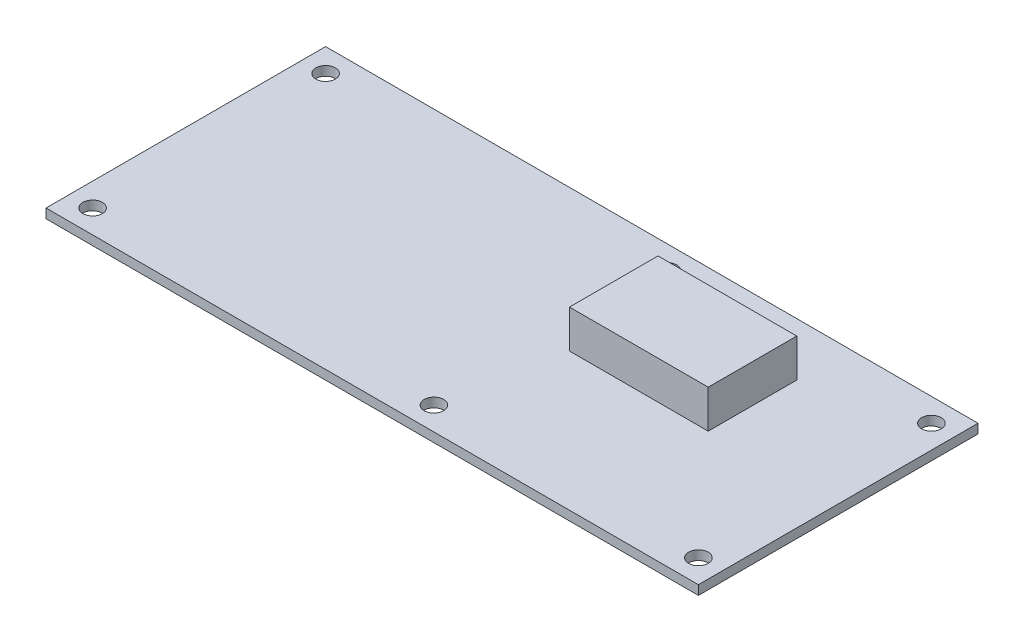
ISO-10303-21;
HEADER;
FILE_DESCRIPTION(('STEP AP214'),'2;1');
FILE_NAME('part.step','',(''),(''),'','','');
FILE_SCHEMA(('AUTOMOTIVE_DESIGN { 1 0 10303 214 1 1 1 1 }'));
ENDSEC;
DATA;
#1=APPLICATION_CONTEXT('core data for automotive mechanical design processes');
#2=APPLICATION_PROTOCOL_DEFINITION('international standard','automotive_design',2000,#1);
#3=PRODUCT_CONTEXT('',#1,'mechanical');
#4=PRODUCT('Part','Part','',(#3));
#5=PRODUCT_RELATED_PRODUCT_CATEGORY('part','',(#4));
#6=PRODUCT_DEFINITION_FORMATION('','',#4);
#7=PRODUCT_DEFINITION_CONTEXT('part definition',#1,'design');
#8=PRODUCT_DEFINITION('design','',#6,#7);
#9=PRODUCT_DEFINITION_SHAPE('','',#8);
#10=(LENGTH_UNIT() NAMED_UNIT(*) SI_UNIT(.MILLI.,.METRE.));
#11=(NAMED_UNIT(*) PLANE_ANGLE_UNIT() SI_UNIT($,.RADIAN.));
#12=(NAMED_UNIT(*) SI_UNIT($,.STERADIAN.) SOLID_ANGLE_UNIT());
#13=UNCERTAINTY_MEASURE_WITH_UNIT(LENGTH_MEASURE(1.E-05),#10,'distance_accuracy_value','');
#14=(GEOMETRIC_REPRESENTATION_CONTEXT(3) GLOBAL_UNCERTAINTY_ASSIGNED_CONTEXT((#13)) GLOBAL_UNIT_ASSIGNED_CONTEXT((#10,
#11,#12)) REPRESENTATION_CONTEXT('',''));
#15=CARTESIAN_POINT('',(0.,0.,0.));
#16=DIRECTION('',(0.,0.,1.));
#17=DIRECTION('',(1.,0.,0.));
#18=AXIS2_PLACEMENT_3D('',#15,#16,#17);
#19=CARTESIAN_POINT('',(0.,2.,0.));
#20=DIRECTION('',(0.,1.,0.));
#21=DIRECTION('',(0.,0.,1.));
#22=AXIS2_PLACEMENT_3D('',#19,#20,#21);
#23=PLANE('',#22);
#24=CARTESIAN_POINT('',(56.75,2.,25.));
#25=DIRECTION('',(0.,1.,0.));
#26=DIRECTION('',(0.,0.,1.));
#27=AXIS2_PLACEMENT_3D('',#24,#25,#26);
#28=CIRCLE('',#27,2.0955);
#29=CARTESIAN_POINT('',(56.75,2.,27.0955));
#30=VERTEX_POINT('',#29);
#31=EDGE_CURVE('E174',#30,#30,#28,.T.);
#32=ORIENTED_EDGE('',*,*,#31,.F.);
#33=EDGE_LOOP('',(#32));
#34=FACE_BOUND('',#33,.T.);
#35=CARTESIAN_POINT('',(56.75,2.,-25.));
#36=DIRECTION('',(0.,1.,0.));
#37=DIRECTION('',(0.,0.,1.));
#38=AXIS2_PLACEMENT_3D('',#35,#36,#37);
#39=CIRCLE('',#38,2.0955);
#40=CARTESIAN_POINT('',(56.75,2.,-22.9045));
#41=VERTEX_POINT('',#40);
#42=EDGE_CURVE('E177',#41,#41,#39,.T.);
#43=ORIENTED_EDGE('',*,*,#42,.F.);
#44=EDGE_LOOP('',(#43));
#45=FACE_BOUND('',#44,.T.);
#46=CARTESIAN_POINT('',(0.,2.,-25.));
#47=DIRECTION('',(0.,1.,0.));
#48=DIRECTION('',(0.,0.,1.));
#49=AXIS2_PLACEMENT_3D('',#46,#47,#48);
#50=CIRCLE('',#49,2.0955);
#51=CARTESIAN_POINT('',(0.,2.,-22.9045));
#52=VERTEX_POINT('',#51);
#53=EDGE_CURVE('E180',#52,#52,#50,.T.);
#54=ORIENTED_EDGE('',*,*,#53,.F.);
#55=EDGE_LOOP('',(#54));
#56=FACE_BOUND('',#55,.T.);
#57=CARTESIAN_POINT('',(0.,2.,25.));
#58=DIRECTION('',(0.,1.,0.));
#59=DIRECTION('',(0.,0.,1.));
#60=AXIS2_PLACEMENT_3D('',#57,#58,#59);
#61=CIRCLE('',#60,2.0955);
#62=CARTESIAN_POINT('',(0.,2.,27.0955));
#63=VERTEX_POINT('',#62);
#64=EDGE_CURVE('E183',#63,#63,#61,.T.);
#65=ORIENTED_EDGE('',*,*,#64,.F.);
#66=EDGE_LOOP('',(#65));
#67=FACE_BOUND('',#66,.T.);
#68=CARTESIAN_POINT('',(-73.25,2.,-25.));
#69=DIRECTION('',(0.,1.,0.));
#70=DIRECTION('',(0.,0.,1.));
#71=AXIS2_PLACEMENT_3D('',#68,#69,#70);
#72=CIRCLE('',#71,2.0955);
#73=CARTESIAN_POINT('',(-73.25,2.,-22.9045));
#74=VERTEX_POINT('',#73);
#75=EDGE_CURVE('E186',#74,#74,#72,.T.);
#76=ORIENTED_EDGE('',*,*,#75,.F.);
#77=EDGE_LOOP('',(#76));
#78=FACE_BOUND('',#77,.T.);
#79=CARTESIAN_POINT('',(-73.25,2.,25.));
#80=DIRECTION('',(0.,1.,0.));
#81=DIRECTION('',(0.,0.,1.));
#82=AXIS2_PLACEMENT_3D('',#79,#80,#81);
#83=CIRCLE('',#82,2.0955);
#84=CARTESIAN_POINT('',(-73.25,2.,27.0955));
#85=VERTEX_POINT('',#84);
#86=EDGE_CURVE('E189',#85,#85,#83,.T.);
#87=ORIENTED_EDGE('',*,*,#86,.F.);
#88=EDGE_LOOP('',(#87));
#89=FACE_BOUND('',#88,.T.);
#90=DIRECTION('',(0.,0.,1.));
#91=VECTOR('',#90,1.);
#92=CARTESIAN_POINT('',(61.75,2.,0.));
#93=LINE('',#92,#91);
#94=CARTESIAN_POINT('',(61.75,2.,-30.));
#95=VERTEX_POINT('',#94);
#96=CARTESIAN_POINT('',(61.75,2.,30.));
#97=VERTEX_POINT('',#96);
#98=EDGE_CURVE('E167',#95,#97,#93,.T.);
#99=ORIENTED_EDGE('',*,*,#98,.F.);
#100=DIRECTION('',(1.,0.,0.));
#101=VECTOR('',#100,1.);
#102=CARTESIAN_POINT('',(0.,2.,-30.));
#103=LINE('',#102,#101);
#104=CARTESIAN_POINT('',(-78.25,2.,-30.));
#105=VERTEX_POINT('',#104);
#106=EDGE_CURVE('E171',#105,#95,#103,.T.);
#107=ORIENTED_EDGE('',*,*,#106,.F.);
#108=DIRECTION('',(0.,0.,1.));
#109=VECTOR('',#108,1.);
#110=CARTESIAN_POINT('',(-78.25,2.,0.));
#111=LINE('',#110,#109);
#112=CARTESIAN_POINT('',(-78.25,2.,30.));
#113=VERTEX_POINT('',#112);
#114=EDGE_CURVE('E84',#105,#113,#111,.T.);
#115=ORIENTED_EDGE('',*,*,#114,.T.);
#116=DIRECTION('',(1.,0.,0.));
#117=VECTOR('',#116,1.);
#118=CARTESIAN_POINT('',(0.,2.,30.));
#119=LINE('',#118,#117);
#120=EDGE_CURVE('E109',#113,#97,#119,.T.);
#121=ORIENTED_EDGE('',*,*,#120,.T.);
#122=EDGE_LOOP('',(#99,#107,#115,#121));
#123=FACE_BOUND('',#122,.T.);
#124=DIRECTION('',(1.,0.,0.));
#125=VECTOR('',#124,1.);
#126=CARTESIAN_POINT('',(4.49822493646934,2.,0.414801434061474));
#127=LINE('',#126,#125);
#128=CARTESIAN_POINT('',(4.49822493646934,2.,0.414801434061474));
#129=VERTEX_POINT('',#128);
#130=CARTESIAN_POINT('',(34.2753144136481,2.,0.414801434061474));
#131=VERTEX_POINT('',#130);
#132=EDGE_CURVE('E236',#129,#131,#127,.T.);
#133=ORIENTED_EDGE('',*,*,#132,.F.);
#134=DIRECTION('',(0.,0.,1.));
#135=VECTOR('',#134,1.);
#136=CARTESIAN_POINT('',(4.49822493646934,2.,0.414801434061474));
#137=LINE('',#136,#135);
#138=CARTESIAN_POINT('',(4.49822493646934,2.,-18.5854108609362));
#139=VERTEX_POINT('',#138);
#140=EDGE_CURVE('E156',#139,#129,#137,.T.);
#141=ORIENTED_EDGE('',*,*,#140,.F.);
#142=DIRECTION('',(-1.,0.,0.));
#143=VECTOR('',#142,1.);
#144=CARTESIAN_POINT('',(4.49822493646934,2.,-18.5854108609362));
#145=LINE('',#144,#143);
#146=CARTESIAN_POINT('',(34.2753144136481,2.,-18.5854108609362));
#147=VERTEX_POINT('',#146);
#148=EDGE_CURVE('E152',#147,#139,#145,.T.);
#149=ORIENTED_EDGE('',*,*,#148,.F.);
#150=DIRECTION('',(0.,0.,-1.));
#151=VECTOR('',#150,1.);
#152=CARTESIAN_POINT('',(34.2753144136481,2.,0.414801434061474));
#153=LINE('',#152,#151);
#154=EDGE_CURVE('E238',#131,#147,#153,.T.);
#155=ORIENTED_EDGE('',*,*,#154,.F.);
#156=EDGE_LOOP('',(#133,#141,#149,#155));
#157=FACE_BOUND('',#156,.T.);
#158=ADVANCED_FACE('F60',(#34,#45,#56,#67,#78,#89,#123,#157),#23,.T.);
#159=CARTESIAN_POINT('',(0.,0.,0.));
#160=DIRECTION('',(0.,1.,0.));
#161=DIRECTION('',(0.,0.,1.));
#162=AXIS2_PLACEMENT_3D('',#159,#160,#161);
#163=PLANE('',#162);
#164=DIRECTION('',(1.,0.,0.));
#165=VECTOR('',#164,1.);
#166=CARTESIAN_POINT('',(0.,0.,-30.));
#167=LINE('',#166,#165);
#168=CARTESIAN_POINT('',(-78.25,0.,-30.));
#169=VERTEX_POINT('',#168);
#170=CARTESIAN_POINT('',(61.75,0.,-30.));
#171=VERTEX_POINT('',#170);
#172=EDGE_CURVE('E195',#169,#171,#167,.T.);
#173=ORIENTED_EDGE('',*,*,#172,.T.);
#174=DIRECTION('',(0.,0.,1.));
#175=VECTOR('',#174,1.);
#176=CARTESIAN_POINT('',(61.75,0.,0.));
#177=LINE('',#176,#175);
#178=CARTESIAN_POINT('',(61.75,0.,30.));
#179=VERTEX_POINT('',#178);
#180=EDGE_CURVE('E161',#171,#179,#177,.T.);
#181=ORIENTED_EDGE('',*,*,#180,.T.);
#182=DIRECTION('',(1.,0.,0.));
#183=VECTOR('',#182,1.);
#184=CARTESIAN_POINT('',(0.,0.,30.));
#185=LINE('',#184,#183);
#186=CARTESIAN_POINT('',(-78.25,0.,30.));
#187=VERTEX_POINT('',#186);
#188=EDGE_CURVE('E158',#187,#179,#185,.T.);
#189=ORIENTED_EDGE('',*,*,#188,.F.);
#190=DIRECTION('',(0.,0.,1.));
#191=VECTOR('',#190,1.);
#192=CARTESIAN_POINT('',(-78.25,0.,0.));
#193=LINE('',#192,#191);
#194=EDGE_CURVE('E104',#169,#187,#193,.T.);
#195=ORIENTED_EDGE('',*,*,#194,.F.);
#196=EDGE_LOOP('',(#173,#181,#189,#195));
#197=FACE_BOUND('',#196,.T.);
#198=CARTESIAN_POINT('',(-73.25,0.,25.));
#199=DIRECTION('',(0.,1.,0.));
#200=DIRECTION('',(0.,0.,1.));
#201=AXIS2_PLACEMENT_3D('',#198,#199,#200);
#202=CIRCLE('',#201,2.0955);
#203=CARTESIAN_POINT('',(-73.25,0.,27.0955));
#204=VERTEX_POINT('',#203);
#205=EDGE_CURVE('E168',#204,#204,#202,.T.);
#206=ORIENTED_EDGE('',*,*,#205,.T.);
#207=EDGE_LOOP('',(#206));
#208=FACE_BOUND('',#207,.T.);
#209=CARTESIAN_POINT('',(-73.25,0.,-25.));
#210=DIRECTION('',(0.,1.,0.));
#211=DIRECTION('',(0.,0.,1.));
#212=AXIS2_PLACEMENT_3D('',#209,#210,#211);
#213=CIRCLE('',#212,2.0955);
#214=CARTESIAN_POINT('',(-73.25,0.,-22.9045));
#215=VERTEX_POINT('',#214);
#216=EDGE_CURVE('E210',#215,#215,#213,.T.);
#217=ORIENTED_EDGE('',*,*,#216,.T.);
#218=EDGE_LOOP('',(#217));
#219=FACE_BOUND('',#218,.T.);
#220=CARTESIAN_POINT('',(0.,0.,25.));
#221=DIRECTION('',(0.,1.,0.));
#222=DIRECTION('',(0.,0.,1.));
#223=AXIS2_PLACEMENT_3D('',#220,#221,#222);
#224=CIRCLE('',#223,2.0955);
#225=CARTESIAN_POINT('',(0.,0.,27.0955));
#226=VERTEX_POINT('',#225);
#227=EDGE_CURVE('E207',#226,#226,#224,.T.);
#228=ORIENTED_EDGE('',*,*,#227,.T.);
#229=EDGE_LOOP('',(#228));
#230=FACE_BOUND('',#229,.T.);
#231=CARTESIAN_POINT('',(0.,0.,-25.));
#232=DIRECTION('',(0.,1.,0.));
#233=DIRECTION('',(0.,0.,1.));
#234=AXIS2_PLACEMENT_3D('',#231,#232,#233);
#235=CIRCLE('',#234,2.0955);
#236=CARTESIAN_POINT('',(0.,0.,-22.9045));
#237=VERTEX_POINT('',#236);
#238=EDGE_CURVE('E204',#237,#237,#235,.T.);
#239=ORIENTED_EDGE('',*,*,#238,.T.);
#240=EDGE_LOOP('',(#239));
#241=FACE_BOUND('',#240,.T.);
#242=CARTESIAN_POINT('',(56.75,0.,-25.));
#243=DIRECTION('',(0.,1.,0.));
#244=DIRECTION('',(0.,0.,1.));
#245=AXIS2_PLACEMENT_3D('',#242,#243,#244);
#246=CIRCLE('',#245,2.0955);
#247=CARTESIAN_POINT('',(56.75,0.,-22.9045));
#248=VERTEX_POINT('',#247);
#249=EDGE_CURVE('E201',#248,#248,#246,.T.);
#250=ORIENTED_EDGE('',*,*,#249,.T.);
#251=EDGE_LOOP('',(#250));
#252=FACE_BOUND('',#251,.T.);
#253=CARTESIAN_POINT('',(56.75,0.,25.));
#254=DIRECTION('',(0.,1.,0.));
#255=DIRECTION('',(0.,0.,1.));
#256=AXIS2_PLACEMENT_3D('',#253,#254,#255);
#257=CIRCLE('',#256,2.0955);
#258=CARTESIAN_POINT('',(56.75,0.,27.0955));
#259=VERTEX_POINT('',#258);
#260=EDGE_CURVE('E198',#259,#259,#257,.T.);
#261=ORIENTED_EDGE('',*,*,#260,.T.);
#262=EDGE_LOOP('',(#261));
#263=FACE_BOUND('',#262,.T.);
#264=ADVANCED_FACE('F227',(#197,#208,#219,#230,#241,#252,#263),#163,.F.);
#265=CARTESIAN_POINT('',(-78.25,2.,0.));
#266=DIRECTION('',(1.,0.,0.));
#267=DIRECTION('',(0.,0.,-1.));
#268=AXIS2_PLACEMENT_3D('',#265,#266,#267);
#269=PLANE('',#268);
#270=ORIENTED_EDGE('',*,*,#194,.T.);
#271=DIRECTION('',(0.,-1.,0.));
#272=VECTOR('',#271,1.);
#273=CARTESIAN_POINT('',(-78.25,2.,30.));
#274=LINE('',#273,#272);
#275=EDGE_CURVE('E191',#113,#187,#274,.T.);
#276=ORIENTED_EDGE('',*,*,#275,.F.);
#277=ORIENTED_EDGE('',*,*,#114,.F.);
#278=DIRECTION('',(0.,-1.,0.));
#279=VECTOR('',#278,1.);
#280=CARTESIAN_POINT('',(-78.25,2.,-30.));
#281=LINE('',#280,#279);
#282=EDGE_CURVE('E216',#105,#169,#281,.T.);
#283=ORIENTED_EDGE('',*,*,#282,.T.);
#284=EDGE_LOOP('',(#270,#276,#277,#283));
#285=FACE_BOUND('',#284,.T.);
#286=ADVANCED_FACE('F230',(#285),#269,.F.);
#287=CARTESIAN_POINT('',(0.,2.,30.));
#288=DIRECTION('',(0.,0.,-1.));
#289=DIRECTION('',(-1.,0.,0.));
#290=AXIS2_PLACEMENT_3D('',#287,#288,#289);
#291=PLANE('',#290);
#292=ORIENTED_EDGE('',*,*,#188,.T.);
#293=DIRECTION('',(0.,-1.,0.));
#294=VECTOR('',#293,1.);
#295=CARTESIAN_POINT('',(61.75,2.,30.));
#296=LINE('',#295,#294);
#297=EDGE_CURVE('E12',#97,#179,#296,.T.);
#298=ORIENTED_EDGE('',*,*,#297,.F.);
#299=ORIENTED_EDGE('',*,*,#120,.F.);
#300=ORIENTED_EDGE('',*,*,#275,.T.);
#301=EDGE_LOOP('',(#292,#298,#299,#300));
#302=FACE_BOUND('',#301,.T.);
#303=ADVANCED_FACE('F62',(#302),#291,.F.);
#304=CARTESIAN_POINT('',(61.75,2.,0.));
#305=DIRECTION('',(1.,0.,0.));
#306=DIRECTION('',(0.,0.,-1.));
#307=AXIS2_PLACEMENT_3D('',#304,#305,#306);
#308=PLANE('',#307);
#309=ORIENTED_EDGE('',*,*,#180,.F.);
#310=DIRECTION('',(0.,-1.,0.));
#311=VECTOR('',#310,1.);
#312=CARTESIAN_POINT('',(61.75,2.,-30.));
#313=LINE('',#312,#311);
#314=EDGE_CURVE('E68',#95,#171,#313,.T.);
#315=ORIENTED_EDGE('',*,*,#314,.F.);
#316=ORIENTED_EDGE('',*,*,#98,.T.);
#317=ORIENTED_EDGE('',*,*,#297,.T.);
#318=EDGE_LOOP('',(#309,#315,#316,#317));
#319=FACE_BOUND('',#318,.T.);
#320=ADVANCED_FACE('F224',(#319),#308,.T.);
#321=CARTESIAN_POINT('',(0.,2.,-30.));
#322=DIRECTION('',(0.,0.,-1.));
#323=DIRECTION('',(-1.,0.,0.));
#324=AXIS2_PLACEMENT_3D('',#321,#322,#323);
#325=PLANE('',#324);
#326=ORIENTED_EDGE('',*,*,#314,.T.);
#327=ORIENTED_EDGE('',*,*,#172,.F.);
#328=ORIENTED_EDGE('',*,*,#282,.F.);
#329=ORIENTED_EDGE('',*,*,#106,.T.);
#330=EDGE_LOOP('',(#326,#327,#328,#329));
#331=FACE_BOUND('',#330,.T.);
#332=ADVANCED_FACE('F222',(#331),#325,.T.);
#333=CARTESIAN_POINT('',(56.75,2.,25.));
#334=DIRECTION('',(0.,-1.,0.));
#335=DIRECTION('',(0.,0.,-1.));
#336=AXIS2_PLACEMENT_3D('',#333,#334,#335);
#337=CYLINDRICAL_SURFACE('',#336,2.0955);
#338=ORIENTED_EDGE('',*,*,#31,.T.);
#339=EDGE_LOOP('',(#338));
#340=FACE_BOUND('',#339,.T.);
#341=ORIENTED_EDGE('',*,*,#260,.F.);
#342=EDGE_LOOP('',(#341));
#343=FACE_BOUND('',#342,.T.);
#344=ADVANCED_FACE('F284',(#340,#343),#337,.F.);
#345=CARTESIAN_POINT('',(56.75,2.,-25.));
#346=DIRECTION('',(0.,-1.,0.));
#347=DIRECTION('',(0.,0.,-1.));
#348=AXIS2_PLACEMENT_3D('',#345,#346,#347);
#349=CYLINDRICAL_SURFACE('',#348,2.0955);
#350=ORIENTED_EDGE('',*,*,#42,.T.);
#351=EDGE_LOOP('',(#350));
#352=FACE_BOUND('',#351,.T.);
#353=ORIENTED_EDGE('',*,*,#249,.F.);
#354=EDGE_LOOP('',(#353));
#355=FACE_BOUND('',#354,.T.);
#356=ADVANCED_FACE('F280',(#352,#355),#349,.F.);
#357=CARTESIAN_POINT('',(0.,2.,-25.));
#358=DIRECTION('',(0.,-1.,0.));
#359=DIRECTION('',(0.,0.,-1.));
#360=AXIS2_PLACEMENT_3D('',#357,#358,#359);
#361=CYLINDRICAL_SURFACE('',#360,2.0955);
#362=ORIENTED_EDGE('',*,*,#53,.T.);
#363=EDGE_LOOP('',(#362));
#364=FACE_BOUND('',#363,.T.);
#365=ORIENTED_EDGE('',*,*,#238,.F.);
#366=EDGE_LOOP('',(#365));
#367=FACE_BOUND('',#366,.T.);
#368=ADVANCED_FACE('F276',(#364,#367),#361,.F.);
#369=CARTESIAN_POINT('',(0.,2.,25.));
#370=DIRECTION('',(0.,-1.,0.));
#371=DIRECTION('',(0.,0.,-1.));
#372=AXIS2_PLACEMENT_3D('',#369,#370,#371);
#373=CYLINDRICAL_SURFACE('',#372,2.0955);
#374=ORIENTED_EDGE('',*,*,#64,.T.);
#375=EDGE_LOOP('',(#374));
#376=FACE_BOUND('',#375,.T.);
#377=ORIENTED_EDGE('',*,*,#227,.F.);
#378=EDGE_LOOP('',(#377));
#379=FACE_BOUND('',#378,.T.);
#380=ADVANCED_FACE('F272',(#376,#379),#373,.F.);
#381=CARTESIAN_POINT('',(-73.25,2.,-25.));
#382=DIRECTION('',(0.,-1.,0.));
#383=DIRECTION('',(0.,0.,-1.));
#384=AXIS2_PLACEMENT_3D('',#381,#382,#383);
#385=CYLINDRICAL_SURFACE('',#384,2.0955);
#386=ORIENTED_EDGE('',*,*,#75,.T.);
#387=EDGE_LOOP('',(#386));
#388=FACE_BOUND('',#387,.T.);
#389=ORIENTED_EDGE('',*,*,#216,.F.);
#390=EDGE_LOOP('',(#389));
#391=FACE_BOUND('',#390,.T.);
#392=ADVANCED_FACE('F268',(#388,#391),#385,.F.);
#393=CARTESIAN_POINT('',(-73.25,2.,25.));
#394=DIRECTION('',(0.,-1.,0.));
#395=DIRECTION('',(0.,0.,-1.));
#396=AXIS2_PLACEMENT_3D('',#393,#394,#395);
#397=CYLINDRICAL_SURFACE('',#396,2.0955);
#398=ORIENTED_EDGE('',*,*,#86,.T.);
#399=EDGE_LOOP('',(#398));
#400=FACE_BOUND('',#399,.T.);
#401=ORIENTED_EDGE('',*,*,#205,.F.);
#402=EDGE_LOOP('',(#401));
#403=FACE_BOUND('',#402,.T.);
#404=ADVANCED_FACE('F262',(#400,#403),#397,.F.);
#405=CARTESIAN_POINT('',(4.49822493646934,10.174,0.414801434061474));
#406=DIRECTION('',(1.,0.,0.));
#407=DIRECTION('',(0.,0.,-1.));
#408=AXIS2_PLACEMENT_3D('',#405,#406,#407);
#409=PLANE('',#408);
#410=ORIENTED_EDGE('',*,*,#140,.T.);
#411=DIRECTION('',(0.,-1.,0.));
#412=VECTOR('',#411,1.);
#413=CARTESIAN_POINT('',(4.49822493646934,10.174,0.414801434061474));
#414=LINE('',#413,#412);
#415=CARTESIAN_POINT('',(4.49822493646934,10.174,0.414801434061474));
#416=VERTEX_POINT('',#415);
#417=EDGE_CURVE('E137',#416,#129,#414,.T.);
#418=ORIENTED_EDGE('',*,*,#417,.F.);
#419=DIRECTION('',(0.,0.,1.));
#420=VECTOR('',#419,1.);
#421=CARTESIAN_POINT('',(4.49822493646934,10.174,0.414801434061474));
#422=LINE('',#421,#420);
#423=CARTESIAN_POINT('',(4.49822493646934,10.174,-18.5854108609362));
#424=VERTEX_POINT('',#423);
#425=EDGE_CURVE('E144',#424,#416,#422,.T.);
#426=ORIENTED_EDGE('',*,*,#425,.F.);
#427=DIRECTION('',(0.,-1.,0.));
#428=VECTOR('',#427,1.);
#429=CARTESIAN_POINT('',(4.49822493646934,10.174,-18.5854108609362));
#430=LINE('',#429,#428);
#431=EDGE_CURVE('E245',#424,#139,#430,.T.);
#432=ORIENTED_EDGE('',*,*,#431,.T.);
#433=EDGE_LOOP('',(#410,#418,#426,#432));
#434=FACE_BOUND('',#433,.T.);
#435=ADVANCED_FACE('F154',(#434),#409,.F.);
#436=CARTESIAN_POINT('',(4.49822493646934,10.174,0.414801434061474));
#437=DIRECTION('',(0.,0.,-1.));
#438=DIRECTION('',(-1.,0.,0.));
#439=AXIS2_PLACEMENT_3D('',#436,#437,#438);
#440=PLANE('',#439);
#441=ORIENTED_EDGE('',*,*,#132,.T.);
#442=DIRECTION('',(0.,-1.,0.));
#443=VECTOR('',#442,1.);
#444=CARTESIAN_POINT('',(34.2753144136481,10.174,0.414801434061474));
#445=LINE('',#444,#443);
#446=CARTESIAN_POINT('',(34.2753144136481,10.174,0.414801434061474));
#447=VERTEX_POINT('',#446);
#448=EDGE_CURVE('E140',#447,#131,#445,.T.);
#449=ORIENTED_EDGE('',*,*,#448,.F.);
#450=DIRECTION('',(1.,0.,0.));
#451=VECTOR('',#450,1.);
#452=CARTESIAN_POINT('',(4.49822493646934,10.174,0.414801434061474));
#453=LINE('',#452,#451);
#454=EDGE_CURVE('E133',#416,#447,#453,.T.);
#455=ORIENTED_EDGE('',*,*,#454,.F.);
#456=ORIENTED_EDGE('',*,*,#417,.T.);
#457=EDGE_LOOP('',(#441,#449,#455,#456));
#458=FACE_BOUND('',#457,.T.);
#459=ADVANCED_FACE('F135',(#458),#440,.F.);
#460=CARTESIAN_POINT('',(34.2753144136481,10.174,0.414801434061474));
#461=DIRECTION('',(-1.,0.,0.));
#462=DIRECTION('',(0.,0.,1.));
#463=AXIS2_PLACEMENT_3D('',#460,#461,#462);
#464=PLANE('',#463);
#465=ORIENTED_EDGE('',*,*,#154,.T.);
#466=DIRECTION('',(0.,-1.,0.));
#467=VECTOR('',#466,1.);
#468=CARTESIAN_POINT('',(34.2753144136481,10.174,-18.5854108609362));
#469=LINE('',#468,#467);
#470=CARTESIAN_POINT('',(34.2753144136481,10.174,-18.5854108609362));
#471=VERTEX_POINT('',#470);
#472=EDGE_CURVE('E75',#471,#147,#469,.T.);
#473=ORIENTED_EDGE('',*,*,#472,.F.);
#474=DIRECTION('',(0.,0.,-1.));
#475=VECTOR('',#474,1.);
#476=CARTESIAN_POINT('',(34.2753144136481,10.174,0.414801434061474));
#477=LINE('',#476,#475);
#478=EDGE_CURVE('E143',#447,#471,#477,.T.);
#479=ORIENTED_EDGE('',*,*,#478,.F.);
#480=ORIENTED_EDGE('',*,*,#448,.T.);
#481=EDGE_LOOP('',(#465,#473,#479,#480));
#482=FACE_BOUND('',#481,.T.);
#483=ADVANCED_FACE('F248',(#482),#464,.F.);
#484=CARTESIAN_POINT('',(4.49822493646934,10.174,-18.5854108609362));
#485=DIRECTION('',(0.,0.,1.));
#486=DIRECTION('',(1.,0.,0.));
#487=AXIS2_PLACEMENT_3D('',#484,#485,#486);
#488=PLANE('',#487);
#489=ORIENTED_EDGE('',*,*,#148,.T.);
#490=ORIENTED_EDGE('',*,*,#431,.F.);
#491=DIRECTION('',(-1.,0.,0.));
#492=VECTOR('',#491,1.);
#493=CARTESIAN_POINT('',(4.49822493646934,10.174,-18.5854108609362));
#494=LINE('',#493,#492);
#495=EDGE_CURVE('E148',#471,#424,#494,.T.);
#496=ORIENTED_EDGE('',*,*,#495,.F.);
#497=ORIENTED_EDGE('',*,*,#472,.T.);
#498=EDGE_LOOP('',(#489,#490,#496,#497));
#499=FACE_BOUND('',#498,.T.);
#500=ADVANCED_FACE('F249',(#499),#488,.F.);
#501=CARTESIAN_POINT('',(0.,10.174,0.));
#502=DIRECTION('',(0.,-1.,0.));
#503=DIRECTION('',(0.,0.,-1.));
#504=AXIS2_PLACEMENT_3D('',#501,#502,#503);
#505=PLANE('',#504);
#506=ORIENTED_EDGE('',*,*,#425,.T.);
#507=ORIENTED_EDGE('',*,*,#454,.T.);
#508=ORIENTED_EDGE('',*,*,#478,.T.);
#509=ORIENTED_EDGE('',*,*,#495,.T.);
#510=EDGE_LOOP('',(#506,#507,#508,#509));
#511=FACE_BOUND('',#510,.T.);
#512=ADVANCED_FACE('F147',(#511),#505,.F.);
#513=CLOSED_SHELL('',(#158,#264,#286,#303,#320,#332,#344,#356,#368,#380,#392,#404,#435,#459,
#483,#500,#512));
#514=MANIFOLD_SOLID_BREP('B2',#513);
#515=ADVANCED_BREP_SHAPE_REPRESENTATION('',(#18,#514),#14);
#516=SHAPE_DEFINITION_REPRESENTATION(#9,#515);
ENDSEC;
END-ISO-10303-21;
